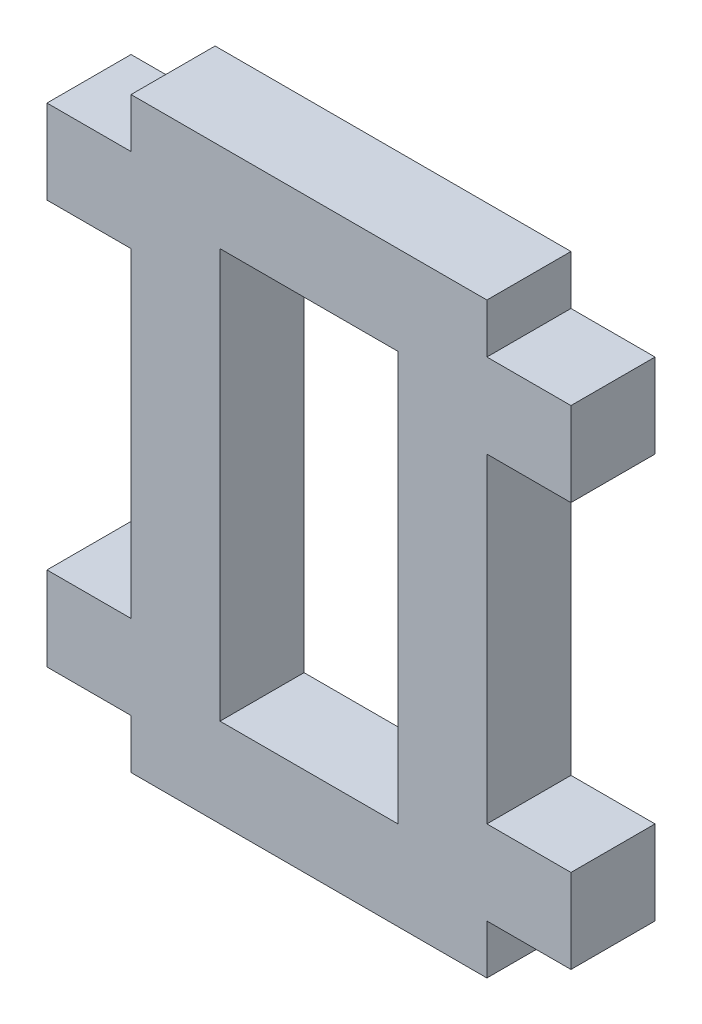
ISO-10303-21;
HEADER;
FILE_DESCRIPTION(('STEP AP214'),'2;1');
FILE_NAME('part.step','',(''),(''),'','','');
FILE_SCHEMA(('AUTOMOTIVE_DESIGN { 1 0 10303 214 1 1 1 1 }'));
ENDSEC;
DATA;
#1=APPLICATION_CONTEXT('core data for automotive mechanical design processes');
#2=APPLICATION_PROTOCOL_DEFINITION('international standard','automotive_design',2000,#1);
#3=PRODUCT_CONTEXT('',#1,'mechanical');
#4=PRODUCT('Part','Part','',(#3));
#5=PRODUCT_RELATED_PRODUCT_CATEGORY('part','',(#4));
#6=PRODUCT_DEFINITION_FORMATION('','',#4);
#7=PRODUCT_DEFINITION_CONTEXT('part definition',#1,'design');
#8=PRODUCT_DEFINITION('design','',#6,#7);
#9=PRODUCT_DEFINITION_SHAPE('','',#8);
#10=(LENGTH_UNIT() NAMED_UNIT(*) SI_UNIT(.MILLI.,.METRE.));
#11=(NAMED_UNIT(*) PLANE_ANGLE_UNIT() SI_UNIT($,.RADIAN.));
#12=(NAMED_UNIT(*) SI_UNIT($,.STERADIAN.) SOLID_ANGLE_UNIT());
#13=UNCERTAINTY_MEASURE_WITH_UNIT(LENGTH_MEASURE(1.E-05),#10,'distance_accuracy_value','');
#14=(GEOMETRIC_REPRESENTATION_CONTEXT(3) GLOBAL_UNCERTAINTY_ASSIGNED_CONTEXT((#13)) GLOBAL_UNIT_ASSIGNED_CONTEXT((#10,
#11,#12)) REPRESENTATION_CONTEXT('',''));
#15=CARTESIAN_POINT('',(0.,0.,0.));
#16=DIRECTION('',(0.,0.,1.));
#17=DIRECTION('',(1.,0.,0.));
#18=AXIS2_PLACEMENT_3D('',#15,#16,#17);
#19=CARTESIAN_POINT('',(-18.7,0.,6.));
#20=DIRECTION('',(1.,0.,0.));
#21=DIRECTION('',(0.,0.,-1.));
#22=AXIS2_PLACEMENT_3D('',#19,#20,#21);
#23=PLANE('',#22);
#24=DIRECTION('',(0.,-1.,0.));
#25=VECTOR('',#24,1.);
#26=CARTESIAN_POINT('',(-18.7,0.,0.));
#27=LINE('',#26,#25);
#28=CARTESIAN_POINT('',(-18.7,17.43,0.));
#29=VERTEX_POINT('',#28);
#30=CARTESIAN_POINT('',(-18.7,11.43,0.));
#31=VERTEX_POINT('',#30);
#32=EDGE_CURVE('E252',#29,#31,#27,.T.);
#33=ORIENTED_EDGE('',*,*,#32,.T.);
#34=DIRECTION('',(0.,0.,-1.));
#35=VECTOR('',#34,1.);
#36=CARTESIAN_POINT('',(-18.7,11.43,6.));
#37=LINE('',#36,#35);
#38=CARTESIAN_POINT('',(-18.7,11.43,6.));
#39=VERTEX_POINT('',#38);
#40=EDGE_CURVE('E11',#39,#31,#37,.T.);
#41=ORIENTED_EDGE('',*,*,#40,.F.);
#42=DIRECTION('',(0.,-1.,0.));
#43=VECTOR('',#42,1.);
#44=CARTESIAN_POINT('',(-18.7,0.,6.));
#45=LINE('',#44,#43);
#46=CARTESIAN_POINT('',(-18.7,17.43,6.));
#47=VERTEX_POINT('',#46);
#48=EDGE_CURVE('E258',#47,#39,#45,.T.);
#49=ORIENTED_EDGE('',*,*,#48,.F.);
#50=DIRECTION('',(0.,0.,-1.));
#51=VECTOR('',#50,1.);
#52=CARTESIAN_POINT('',(-18.7,17.43,6.));
#53=LINE('',#52,#51);
#54=EDGE_CURVE('E320',#47,#29,#53,.T.);
#55=ORIENTED_EDGE('',*,*,#54,.T.);
#56=EDGE_LOOP('',(#33,#41,#49,#55));
#57=FACE_BOUND('',#56,.T.);
#58=ADVANCED_FACE('F48',(#57),#23,.F.);
#59=CARTESIAN_POINT('',(0.,11.43,6.));
#60=DIRECTION('',(0.,1.,0.));
#61=DIRECTION('',(-1.,0.,0.));
#62=AXIS2_PLACEMENT_3D('',#59,#60,#61);
#63=PLANE('',#62);
#64=DIRECTION('',(1.,0.,0.));
#65=VECTOR('',#64,1.);
#66=CARTESIAN_POINT('',(0.,11.43,0.));
#67=LINE('',#66,#65);
#68=CARTESIAN_POINT('',(-12.7,11.43,0.));
#69=VERTEX_POINT('',#68);
#70=EDGE_CURVE('E324',#31,#69,#67,.T.);
#71=ORIENTED_EDGE('',*,*,#70,.T.);
#72=DIRECTION('',(0.,0.,-1.));
#73=VECTOR('',#72,1.);
#74=CARTESIAN_POINT('',(-12.7,11.43,6.));
#75=LINE('',#74,#73);
#76=CARTESIAN_POINT('',(-12.7,11.43,6.));
#77=VERTEX_POINT('',#76);
#78=EDGE_CURVE('E56',#77,#69,#75,.T.);
#79=ORIENTED_EDGE('',*,*,#78,.F.);
#80=DIRECTION('',(1.,0.,0.));
#81=VECTOR('',#80,1.);
#82=CARTESIAN_POINT('',(0.,11.43,6.));
#83=LINE('',#82,#81);
#84=EDGE_CURVE('E262',#39,#77,#83,.T.);
#85=ORIENTED_EDGE('',*,*,#84,.F.);
#86=ORIENTED_EDGE('',*,*,#40,.T.);
#87=EDGE_LOOP('',(#71,#79,#85,#86));
#88=FACE_BOUND('',#87,.T.);
#89=ADVANCED_FACE('F528',(#88),#63,.F.);
#90=CARTESIAN_POINT('',(-12.7,0.,6.));
#91=DIRECTION('',(1.,0.,0.));
#92=DIRECTION('',(0.,1.,0.));
#93=AXIS2_PLACEMENT_3D('',#90,#91,#92);
#94=PLANE('',#93);
#95=DIRECTION('',(0.,-1.,0.));
#96=VECTOR('',#95,1.);
#97=CARTESIAN_POINT('',(-12.7,0.,0.));
#98=LINE('',#97,#96);
#99=CARTESIAN_POINT('',(-12.7,-11.43,0.));
#100=VERTEX_POINT('',#99);
#101=EDGE_CURVE('E327',#69,#100,#98,.T.);
#102=ORIENTED_EDGE('',*,*,#101,.T.);
#103=DIRECTION('',(0.,0.,-1.));
#104=VECTOR('',#103,1.);
#105=CARTESIAN_POINT('',(-12.7,-11.43,6.));
#106=LINE('',#105,#104);
#107=CARTESIAN_POINT('',(-12.7,-11.43,6.));
#108=VERTEX_POINT('',#107);
#109=EDGE_CURVE('E437',#108,#100,#106,.T.);
#110=ORIENTED_EDGE('',*,*,#109,.F.);
#111=DIRECTION('',(0.,-1.,0.));
#112=VECTOR('',#111,1.);
#113=CARTESIAN_POINT('',(-12.7,0.,6.));
#114=LINE('',#113,#112);
#115=EDGE_CURVE('E266',#77,#108,#114,.T.);
#116=ORIENTED_EDGE('',*,*,#115,.F.);
#117=ORIENTED_EDGE('',*,*,#78,.T.);
#118=EDGE_LOOP('',(#102,#110,#116,#117));
#119=FACE_BOUND('',#118,.T.);
#120=ADVANCED_FACE('F445',(#119),#94,.F.);
#121=CARTESIAN_POINT('',(0.,-11.43,6.));
#122=DIRECTION('',(0.,1.,0.));
#123=DIRECTION('',(-1.,0.,0.));
#124=AXIS2_PLACEMENT_3D('',#121,#122,#123);
#125=PLANE('',#124);
#126=DIRECTION('',(1.,0.,0.));
#127=VECTOR('',#126,1.);
#128=CARTESIAN_POINT('',(0.,-11.43,0.));
#129=LINE('',#128,#127);
#130=CARTESIAN_POINT('',(-18.7,-11.43,0.));
#131=VERTEX_POINT('',#130);
#132=EDGE_CURVE('E331',#131,#100,#129,.T.);
#133=ORIENTED_EDGE('',*,*,#132,.F.);
#134=DIRECTION('',(0.,0.,-1.));
#135=VECTOR('',#134,1.);
#136=CARTESIAN_POINT('',(-18.7,-11.43,6.));
#137=LINE('',#136,#135);
#138=CARTESIAN_POINT('',(-18.7,-11.43,6.));
#139=VERTEX_POINT('',#138);
#140=EDGE_CURVE('E434',#139,#131,#137,.T.);
#141=ORIENTED_EDGE('',*,*,#140,.F.);
#142=DIRECTION('',(1.,0.,0.));
#143=VECTOR('',#142,1.);
#144=CARTESIAN_POINT('',(0.,-11.43,6.));
#145=LINE('',#144,#143);
#146=EDGE_CURVE('E269',#139,#108,#145,.T.);
#147=ORIENTED_EDGE('',*,*,#146,.T.);
#148=ORIENTED_EDGE('',*,*,#109,.T.);
#149=EDGE_LOOP('',(#133,#141,#147,#148));
#150=FACE_BOUND('',#149,.T.);
#151=ADVANCED_FACE('F453',(#150),#125,.T.);
#152=CARTESIAN_POINT('',(-18.7,0.,6.));
#153=DIRECTION('',(-1.,0.,0.));
#154=DIRECTION('',(0.,-1.,0.));
#155=AXIS2_PLACEMENT_3D('',#152,#153,#154);
#156=PLANE('',#155);
#157=DIRECTION('',(0.,1.,0.));
#158=VECTOR('',#157,1.);
#159=CARTESIAN_POINT('',(-18.7,0.,0.));
#160=LINE('',#159,#158);
#161=CARTESIAN_POINT('',(-18.7,-17.43,0.));
#162=VERTEX_POINT('',#161);
#163=EDGE_CURVE('E337',#162,#131,#160,.T.);
#164=ORIENTED_EDGE('',*,*,#163,.F.);
#165=DIRECTION('',(0.,0.,-1.));
#166=VECTOR('',#165,1.);
#167=CARTESIAN_POINT('',(-18.7,-17.43,6.));
#168=LINE('',#167,#166);
#169=CARTESIAN_POINT('',(-18.7,-17.43,6.));
#170=VERTEX_POINT('',#169);
#171=EDGE_CURVE('E431',#170,#162,#168,.T.);
#172=ORIENTED_EDGE('',*,*,#171,.F.);
#173=DIRECTION('',(0.,1.,0.));
#174=VECTOR('',#173,1.);
#175=CARTESIAN_POINT('',(-18.7,0.,6.));
#176=LINE('',#175,#174);
#177=EDGE_CURVE('E275',#170,#139,#176,.T.);
#178=ORIENTED_EDGE('',*,*,#177,.T.);
#179=ORIENTED_EDGE('',*,*,#140,.T.);
#180=EDGE_LOOP('',(#164,#172,#178,#179));
#181=FACE_BOUND('',#180,.T.);
#182=ADVANCED_FACE('F459',(#181),#156,.T.);
#183=CARTESIAN_POINT('',(0.,-17.43,6.));
#184=DIRECTION('',(0.,1.,0.));
#185=DIRECTION('',(-1.,0.,0.));
#186=AXIS2_PLACEMENT_3D('',#183,#184,#185);
#187=PLANE('',#186);
#188=DIRECTION('',(1.,0.,0.));
#189=VECTOR('',#188,1.);
#190=CARTESIAN_POINT('',(0.,-17.43,0.));
#191=LINE('',#190,#189);
#192=CARTESIAN_POINT('',(-12.7,-17.43,0.));
#193=VERTEX_POINT('',#192);
#194=EDGE_CURVE('E341',#162,#193,#191,.T.);
#195=ORIENTED_EDGE('',*,*,#194,.T.);
#196=DIRECTION('',(0.,0.,-1.));
#197=VECTOR('',#196,1.);
#198=CARTESIAN_POINT('',(-12.7,-17.43,6.));
#199=LINE('',#198,#197);
#200=CARTESIAN_POINT('',(-12.7,-17.43,6.));
#201=VERTEX_POINT('',#200);
#202=EDGE_CURVE('E427',#201,#193,#199,.T.);
#203=ORIENTED_EDGE('',*,*,#202,.F.);
#204=DIRECTION('',(1.,0.,0.));
#205=VECTOR('',#204,1.);
#206=CARTESIAN_POINT('',(0.,-17.43,6.));
#207=LINE('',#206,#205);
#208=EDGE_CURVE('E279',#170,#201,#207,.T.);
#209=ORIENTED_EDGE('',*,*,#208,.F.);
#210=ORIENTED_EDGE('',*,*,#171,.T.);
#211=EDGE_LOOP('',(#195,#203,#209,#210));
#212=FACE_BOUND('',#211,.T.);
#213=ADVANCED_FACE('F463',(#212),#187,.F.);
#214=CARTESIAN_POINT('',(-12.7,-20.955,0.));
#215=VERTEX_POINT('',#214);
#216=EDGE_CURVE('E333',#193,#215,#98,.T.);
#217=ORIENTED_EDGE('',*,*,#216,.T.);
#218=DIRECTION('',(0.,0.,-1.));
#219=VECTOR('',#218,1.);
#220=CARTESIAN_POINT('',(-12.7,-20.955,6.));
#221=LINE('',#220,#219);
#222=CARTESIAN_POINT('',(-12.7,-20.955,6.));
#223=VERTEX_POINT('',#222);
#224=EDGE_CURVE('E423',#223,#215,#221,.T.);
#225=ORIENTED_EDGE('',*,*,#224,.F.);
#226=EDGE_CURVE('E271',#201,#223,#114,.T.);
#227=ORIENTED_EDGE('',*,*,#226,.F.);
#228=ORIENTED_EDGE('',*,*,#202,.T.);
#229=EDGE_LOOP('',(#217,#225,#227,#228));
#230=FACE_BOUND('',#229,.T.);
#231=ADVANCED_FACE('F471',(#230),#94,.F.);
#232=CARTESIAN_POINT('',(0.,-20.955,6.));
#233=DIRECTION('',(0.,1.,0.));
#234=DIRECTION('',(0.,0.,1.));
#235=AXIS2_PLACEMENT_3D('',#232,#233,#234);
#236=PLANE('',#235);
#237=DIRECTION('',(1.,0.,0.));
#238=VECTOR('',#237,1.);
#239=CARTESIAN_POINT('',(0.,-20.955,0.));
#240=LINE('',#239,#238);
#241=CARTESIAN_POINT('',(12.7,-20.955,0.));
#242=VERTEX_POINT('',#241);
#243=EDGE_CURVE('E344',#215,#242,#240,.T.);
#244=ORIENTED_EDGE('',*,*,#243,.T.);
#245=DIRECTION('',(0.,0.,-1.));
#246=VECTOR('',#245,1.);
#247=CARTESIAN_POINT('',(12.7,-20.955,6.));
#248=LINE('',#247,#246);
#249=CARTESIAN_POINT('',(12.7,-20.955,6.));
#250=VERTEX_POINT('',#249);
#251=EDGE_CURVE('E420',#250,#242,#248,.T.);
#252=ORIENTED_EDGE('',*,*,#251,.F.);
#253=DIRECTION('',(1.,0.,0.));
#254=VECTOR('',#253,1.);
#255=CARTESIAN_POINT('',(0.,-20.955,6.));
#256=LINE('',#255,#254);
#257=EDGE_CURVE('E282',#223,#250,#256,.T.);
#258=ORIENTED_EDGE('',*,*,#257,.F.);
#259=ORIENTED_EDGE('',*,*,#224,.T.);
#260=EDGE_LOOP('',(#244,#252,#258,#259));
#261=FACE_BOUND('',#260,.T.);
#262=ADVANCED_FACE('F475',(#261),#236,.F.);
#263=CARTESIAN_POINT('',(12.7,0.,6.));
#264=DIRECTION('',(1.,0.,0.));
#265=DIRECTION('',(0.,0.,-1.));
#266=AXIS2_PLACEMENT_3D('',#263,#264,#265);
#267=PLANE('',#266);
#268=DIRECTION('',(0.,-1.,0.));
#269=VECTOR('',#268,1.);
#270=CARTESIAN_POINT('',(12.7,0.,0.));
#271=LINE('',#270,#269);
#272=CARTESIAN_POINT('',(12.7,-17.43,0.));
#273=VERTEX_POINT('',#272);
#274=EDGE_CURVE('E348',#273,#242,#271,.T.);
#275=ORIENTED_EDGE('',*,*,#274,.F.);
#276=DIRECTION('',(0.,0.,-1.));
#277=VECTOR('',#276,1.);
#278=CARTESIAN_POINT('',(12.7,-17.43,6.));
#279=LINE('',#278,#277);
#280=CARTESIAN_POINT('',(12.7,-17.43,6.));
#281=VERTEX_POINT('',#280);
#282=EDGE_CURVE('E417',#281,#273,#279,.T.);
#283=ORIENTED_EDGE('',*,*,#282,.F.);
#284=DIRECTION('',(0.,-1.,0.));
#285=VECTOR('',#284,1.);
#286=CARTESIAN_POINT('',(12.7,0.,6.));
#287=LINE('',#286,#285);
#288=EDGE_CURVE('E285',#281,#250,#287,.T.);
#289=ORIENTED_EDGE('',*,*,#288,.T.);
#290=ORIENTED_EDGE('',*,*,#251,.T.);
#291=EDGE_LOOP('',(#275,#283,#289,#290));
#292=FACE_BOUND('',#291,.T.);
#293=ADVANCED_FACE('F478',(#292),#267,.T.);
#294=CARTESIAN_POINT('',(0.,-17.43,6.));
#295=DIRECTION('',(0.,-1.,0.));
#296=DIRECTION('',(1.,0.,0.));
#297=AXIS2_PLACEMENT_3D('',#294,#295,#296);
#298=PLANE('',#297);
#299=DIRECTION('',(-1.,0.,0.));
#300=VECTOR('',#299,1.);
#301=CARTESIAN_POINT('',(0.,-17.43,0.));
#302=LINE('',#301,#300);
#303=CARTESIAN_POINT('',(18.7,-17.43,0.));
#304=VERTEX_POINT('',#303);
#305=EDGE_CURVE('E352',#304,#273,#302,.T.);
#306=ORIENTED_EDGE('',*,*,#305,.F.);
#307=DIRECTION('',(0.,0.,-1.));
#308=VECTOR('',#307,1.);
#309=CARTESIAN_POINT('',(18.7,-17.43,6.));
#310=LINE('',#309,#308);
#311=CARTESIAN_POINT('',(18.7,-17.43,6.));
#312=VERTEX_POINT('',#311);
#313=EDGE_CURVE('E414',#312,#304,#310,.T.);
#314=ORIENTED_EDGE('',*,*,#313,.F.);
#315=DIRECTION('',(-1.,0.,0.));
#316=VECTOR('',#315,1.);
#317=CARTESIAN_POINT('',(0.,-17.43,6.));
#318=LINE('',#317,#316);
#319=EDGE_CURVE('E289',#312,#281,#318,.T.);
#320=ORIENTED_EDGE('',*,*,#319,.T.);
#321=ORIENTED_EDGE('',*,*,#282,.T.);
#322=EDGE_LOOP('',(#306,#314,#320,#321));
#323=FACE_BOUND('',#322,.T.);
#324=ADVANCED_FACE('F482',(#323),#298,.T.);
#325=CARTESIAN_POINT('',(18.7,0.,6.));
#326=DIRECTION('',(-1.,0.,0.));
#327=DIRECTION('',(0.,-1.,0.));
#328=AXIS2_PLACEMENT_3D('',#325,#326,#327);
#329=PLANE('',#328);
#330=DIRECTION('',(0.,1.,0.));
#331=VECTOR('',#330,1.);
#332=CARTESIAN_POINT('',(18.7,0.,0.));
#333=LINE('',#332,#331);
#334=CARTESIAN_POINT('',(18.7,-11.43,0.));
#335=VERTEX_POINT('',#334);
#336=EDGE_CURVE('E358',#304,#335,#333,.T.);
#337=ORIENTED_EDGE('',*,*,#336,.T.);
#338=DIRECTION('',(0.,0.,-1.));
#339=VECTOR('',#338,1.);
#340=CARTESIAN_POINT('',(18.7,-11.43,6.));
#341=LINE('',#340,#339);
#342=CARTESIAN_POINT('',(18.7,-11.43,6.));
#343=VERTEX_POINT('',#342);
#344=EDGE_CURVE('E410',#343,#335,#341,.T.);
#345=ORIENTED_EDGE('',*,*,#344,.F.);
#346=DIRECTION('',(0.,1.,0.));
#347=VECTOR('',#346,1.);
#348=CARTESIAN_POINT('',(18.7,0.,6.));
#349=LINE('',#348,#347);
#350=EDGE_CURVE('E295',#312,#343,#349,.T.);
#351=ORIENTED_EDGE('',*,*,#350,.F.);
#352=ORIENTED_EDGE('',*,*,#313,.T.);
#353=EDGE_LOOP('',(#337,#345,#351,#352));
#354=FACE_BOUND('',#353,.T.);
#355=ADVANCED_FACE('F487',(#354),#329,.F.);
#356=CARTESIAN_POINT('',(0.,-11.43,6.));
#357=DIRECTION('',(0.,-1.,0.));
#358=DIRECTION('',(1.,0.,0.));
#359=AXIS2_PLACEMENT_3D('',#356,#357,#358);
#360=PLANE('',#359);
#361=DIRECTION('',(-1.,0.,0.));
#362=VECTOR('',#361,1.);
#363=CARTESIAN_POINT('',(0.,-11.43,0.));
#364=LINE('',#363,#362);
#365=CARTESIAN_POINT('',(12.7,-11.43,0.));
#366=VERTEX_POINT('',#365);
#367=EDGE_CURVE('E361',#335,#366,#364,.T.);
#368=ORIENTED_EDGE('',*,*,#367,.T.);
#369=DIRECTION('',(0.,0.,-1.));
#370=VECTOR('',#369,1.);
#371=CARTESIAN_POINT('',(12.7,-11.43,6.));
#372=LINE('',#371,#370);
#373=CARTESIAN_POINT('',(12.7,-11.43,6.));
#374=VERTEX_POINT('',#373);
#375=EDGE_CURVE('E407',#374,#366,#372,.T.);
#376=ORIENTED_EDGE('',*,*,#375,.F.);
#377=DIRECTION('',(-1.,0.,0.));
#378=VECTOR('',#377,1.);
#379=CARTESIAN_POINT('',(0.,-11.43,6.));
#380=LINE('',#379,#378);
#381=EDGE_CURVE('E298',#343,#374,#380,.T.);
#382=ORIENTED_EDGE('',*,*,#381,.F.);
#383=ORIENTED_EDGE('',*,*,#344,.T.);
#384=EDGE_LOOP('',(#368,#376,#382,#383));
#385=FACE_BOUND('',#384,.T.);
#386=ADVANCED_FACE('F494',(#385),#360,.F.);
#387=CARTESIAN_POINT('',(12.7,11.43,0.));
#388=VERTEX_POINT('',#387);
#389=EDGE_CURVE('E354',#388,#366,#271,.T.);
#390=ORIENTED_EDGE('',*,*,#389,.F.);
#391=DIRECTION('',(0.,0.,-1.));
#392=VECTOR('',#391,1.);
#393=CARTESIAN_POINT('',(12.7,11.43,6.));
#394=LINE('',#393,#392);
#395=CARTESIAN_POINT('',(12.7,11.43,6.));
#396=VERTEX_POINT('',#395);
#397=EDGE_CURVE('E404',#396,#388,#394,.T.);
#398=ORIENTED_EDGE('',*,*,#397,.F.);
#399=EDGE_CURVE('E291',#396,#374,#287,.T.);
#400=ORIENTED_EDGE('',*,*,#399,.T.);
#401=ORIENTED_EDGE('',*,*,#375,.T.);
#402=EDGE_LOOP('',(#390,#398,#400,#401));
#403=FACE_BOUND('',#402,.T.);
#404=ADVANCED_FACE('F499',(#403),#267,.T.);
#405=CARTESIAN_POINT('',(0.,11.43,6.));
#406=DIRECTION('',(0.,-1.,0.));
#407=DIRECTION('',(1.,0.,0.));
#408=AXIS2_PLACEMENT_3D('',#405,#406,#407);
#409=PLANE('',#408);
#410=DIRECTION('',(-1.,0.,0.));
#411=VECTOR('',#410,1.);
#412=CARTESIAN_POINT('',(0.,11.43,0.));
#413=LINE('',#412,#411);
#414=CARTESIAN_POINT('',(18.7,11.43,0.));
#415=VERTEX_POINT('',#414);
#416=EDGE_CURVE('E365',#415,#388,#413,.T.);
#417=ORIENTED_EDGE('',*,*,#416,.F.);
#418=DIRECTION('',(0.,0.,-1.));
#419=VECTOR('',#418,1.);
#420=CARTESIAN_POINT('',(18.7,11.43,6.));
#421=LINE('',#420,#419);
#422=CARTESIAN_POINT('',(18.7,11.43,6.));
#423=VERTEX_POINT('',#422);
#424=EDGE_CURVE('E401',#423,#415,#421,.T.);
#425=ORIENTED_EDGE('',*,*,#424,.F.);
#426=DIRECTION('',(-1.,0.,0.));
#427=VECTOR('',#426,1.);
#428=CARTESIAN_POINT('',(0.,11.43,6.));
#429=LINE('',#428,#427);
#430=EDGE_CURVE('E301',#423,#396,#429,.T.);
#431=ORIENTED_EDGE('',*,*,#430,.T.);
#432=ORIENTED_EDGE('',*,*,#397,.T.);
#433=EDGE_LOOP('',(#417,#425,#431,#432));
#434=FACE_BOUND('',#433,.T.);
#435=ADVANCED_FACE('F550',(#434),#409,.T.);
#436=CARTESIAN_POINT('',(18.7,0.,6.));
#437=DIRECTION('',(1.,0.,0.));
#438=DIRECTION('',(0.,0.,-1.));
#439=AXIS2_PLACEMENT_3D('',#436,#437,#438);
#440=PLANE('',#439);
#441=DIRECTION('',(0.,-1.,0.));
#442=VECTOR('',#441,1.);
#443=CARTESIAN_POINT('',(18.7,0.,0.));
#444=LINE('',#443,#442);
#445=CARTESIAN_POINT('',(18.7,17.43,0.));
#446=VERTEX_POINT('',#445);
#447=EDGE_CURVE('E369',#446,#415,#444,.T.);
#448=ORIENTED_EDGE('',*,*,#447,.F.);
#449=DIRECTION('',(0.,0.,-1.));
#450=VECTOR('',#449,1.);
#451=CARTESIAN_POINT('',(18.7,17.43,6.));
#452=LINE('',#451,#450);
#453=CARTESIAN_POINT('',(18.7,17.43,6.));
#454=VERTEX_POINT('',#453);
#455=EDGE_CURVE('E398',#454,#446,#452,.T.);
#456=ORIENTED_EDGE('',*,*,#455,.F.);
#457=DIRECTION('',(0.,-1.,0.));
#458=VECTOR('',#457,1.);
#459=CARTESIAN_POINT('',(18.7,0.,6.));
#460=LINE('',#459,#458);
#461=EDGE_CURVE('E305',#454,#423,#460,.T.);
#462=ORIENTED_EDGE('',*,*,#461,.T.);
#463=ORIENTED_EDGE('',*,*,#424,.T.);
#464=EDGE_LOOP('',(#448,#456,#462,#463));
#465=FACE_BOUND('',#464,.T.);
#466=ADVANCED_FACE('F553',(#465),#440,.T.);
#467=CARTESIAN_POINT('',(0.,17.43,6.));
#468=DIRECTION('',(0.,-1.,0.));
#469=DIRECTION('',(0.,0.,-1.));
#470=AXIS2_PLACEMENT_3D('',#467,#468,#469);
#471=PLANE('',#470);
#472=DIRECTION('',(-1.,0.,0.));
#473=VECTOR('',#472,1.);
#474=CARTESIAN_POINT('',(0.,17.43,0.));
#475=LINE('',#474,#473);
#476=CARTESIAN_POINT('',(12.7,17.43,0.));
#477=VERTEX_POINT('',#476);
#478=EDGE_CURVE('E373',#446,#477,#475,.T.);
#479=ORIENTED_EDGE('',*,*,#478,.T.);
#480=DIRECTION('',(0.,0.,-1.));
#481=VECTOR('',#480,1.);
#482=CARTESIAN_POINT('',(12.7,17.43,6.));
#483=LINE('',#482,#481);
#484=CARTESIAN_POINT('',(12.7,17.43,6.));
#485=VERTEX_POINT('',#484);
#486=EDGE_CURVE('E395',#485,#477,#483,.T.);
#487=ORIENTED_EDGE('',*,*,#486,.F.);
#488=DIRECTION('',(-1.,0.,0.));
#489=VECTOR('',#488,1.);
#490=CARTESIAN_POINT('',(0.,17.43,6.));
#491=LINE('',#490,#489);
#492=EDGE_CURVE('E309',#454,#485,#491,.T.);
#493=ORIENTED_EDGE('',*,*,#492,.F.);
#494=ORIENTED_EDGE('',*,*,#455,.T.);
#495=EDGE_LOOP('',(#479,#487,#493,#494));
#496=FACE_BOUND('',#495,.T.);
#497=ADVANCED_FACE('F557',(#496),#471,.F.);
#498=CARTESIAN_POINT('',(12.7,20.955,0.));
#499=VERTEX_POINT('',#498);
#500=EDGE_CURVE('E353',#499,#477,#271,.T.);
#501=ORIENTED_EDGE('',*,*,#500,.F.);
#502=DIRECTION('',(0.,0.,-1.));
#503=VECTOR('',#502,1.);
#504=CARTESIAN_POINT('',(12.7,20.955,6.));
#505=LINE('',#504,#503);
#506=CARTESIAN_POINT('',(12.7,20.955,6.));
#507=VERTEX_POINT('',#506);
#508=EDGE_CURVE('E392',#507,#499,#505,.T.);
#509=ORIENTED_EDGE('',*,*,#508,.F.);
#510=EDGE_CURVE('E290',#507,#485,#287,.T.);
#511=ORIENTED_EDGE('',*,*,#510,.T.);
#512=ORIENTED_EDGE('',*,*,#486,.T.);
#513=EDGE_LOOP('',(#501,#509,#511,#512));
#514=FACE_BOUND('',#513,.T.);
#515=ADVANCED_FACE('F506',(#514),#267,.T.);
#516=CARTESIAN_POINT('',(0.,20.955,6.));
#517=DIRECTION('',(0.,1.,0.));
#518=DIRECTION('',(0.,0.,1.));
#519=AXIS2_PLACEMENT_3D('',#516,#517,#518);
#520=PLANE('',#519);
#521=DIRECTION('',(1.,0.,0.));
#522=VECTOR('',#521,1.);
#523=CARTESIAN_POINT('',(0.,20.955,0.));
#524=LINE('',#523,#522);
#525=CARTESIAN_POINT('',(-12.7,20.955,0.));
#526=VERTEX_POINT('',#525);
#527=EDGE_CURVE('E377',#526,#499,#524,.T.);
#528=ORIENTED_EDGE('',*,*,#527,.F.);
#529=DIRECTION('',(0.,0.,-1.));
#530=VECTOR('',#529,1.);
#531=CARTESIAN_POINT('',(-12.7,20.955,6.));
#532=LINE('',#531,#530);
#533=CARTESIAN_POINT('',(-12.7,20.955,6.));
#534=VERTEX_POINT('',#533);
#535=EDGE_CURVE('E389',#534,#526,#532,.T.);
#536=ORIENTED_EDGE('',*,*,#535,.F.);
#537=DIRECTION('',(1.,0.,0.));
#538=VECTOR('',#537,1.);
#539=CARTESIAN_POINT('',(0.,20.955,6.));
#540=LINE('',#539,#538);
#541=EDGE_CURVE('E312',#534,#507,#540,.T.);
#542=ORIENTED_EDGE('',*,*,#541,.T.);
#543=ORIENTED_EDGE('',*,*,#508,.T.);
#544=EDGE_LOOP('',(#528,#536,#542,#543));
#545=FACE_BOUND('',#544,.T.);
#546=ADVANCED_FACE('F513',(#545),#520,.T.);
#547=CARTESIAN_POINT('',(-12.7,17.43,0.));
#548=VERTEX_POINT('',#547);
#549=EDGE_CURVE('E332',#526,#548,#98,.T.);
#550=ORIENTED_EDGE('',*,*,#549,.T.);
#551=DIRECTION('',(0.,0.,-1.));
#552=VECTOR('',#551,1.);
#553=CARTESIAN_POINT('',(-12.7,17.43,6.));
#554=LINE('',#553,#552);
#555=CARTESIAN_POINT('',(-12.7,17.43,6.));
#556=VERTEX_POINT('',#555);
#557=EDGE_CURVE('E386',#556,#548,#554,.T.);
#558=ORIENTED_EDGE('',*,*,#557,.F.);
#559=EDGE_CURVE('E270',#534,#556,#114,.T.);
#560=ORIENTED_EDGE('',*,*,#559,.F.);
#561=ORIENTED_EDGE('',*,*,#535,.T.);
#562=EDGE_LOOP('',(#550,#558,#560,#561));
#563=FACE_BOUND('',#562,.T.);
#564=ADVANCED_FACE('F519',(#563),#94,.F.);
#565=CARTESIAN_POINT('',(0.,17.43,6.));
#566=DIRECTION('',(0.,1.,0.));
#567=DIRECTION('',(0.,0.,1.));
#568=AXIS2_PLACEMENT_3D('',#565,#566,#567);
#569=PLANE('',#568);
#570=DIRECTION('',(1.,0.,0.));
#571=VECTOR('',#570,1.);
#572=CARTESIAN_POINT('',(0.,17.43,0.));
#573=LINE('',#572,#571);
#574=EDGE_CURVE('E263',#29,#548,#573,.T.);
#575=ORIENTED_EDGE('',*,*,#574,.F.);
#576=ORIENTED_EDGE('',*,*,#54,.F.);
#577=DIRECTION('',(1.,0.,0.));
#578=VECTOR('',#577,1.);
#579=CARTESIAN_POINT('',(0.,17.43,6.));
#580=LINE('',#579,#578);
#581=EDGE_CURVE('E316',#47,#556,#580,.T.);
#582=ORIENTED_EDGE('',*,*,#581,.T.);
#583=ORIENTED_EDGE('',*,*,#557,.T.);
#584=EDGE_LOOP('',(#575,#576,#582,#583));
#585=FACE_BOUND('',#584,.T.);
#586=ADVANCED_FACE('F526',(#585),#569,.T.);
#587=CARTESIAN_POINT('',(0.,0.,6.));
#588=DIRECTION('',(0.,0.,1.));
#589=DIRECTION('',(1.,0.,0.));
#590=AXIS2_PLACEMENT_3D('',#587,#588,#589);
#591=PLANE('',#590);
#592=DIRECTION('',(0.,-1.,0.));
#593=VECTOR('',#592,1.);
#594=CARTESIAN_POINT('',(-6.35,14.605,6.));
#595=LINE('',#594,#593);
#596=CARTESIAN_POINT('',(-6.35,14.605,6.));
#597=VERTEX_POINT('',#596);
#598=CARTESIAN_POINT('',(-6.35,-14.605,6.));
#599=VERTEX_POINT('',#598);
#600=EDGE_CURVE('E63',#597,#599,#595,.T.);
#601=ORIENTED_EDGE('',*,*,#600,.F.);
#602=DIRECTION('',(-1.,0.,0.));
#603=VECTOR('',#602,1.);
#604=CARTESIAN_POINT('',(-6.35,14.605,6.));
#605=LINE('',#604,#603);
#606=CARTESIAN_POINT('',(6.35,14.605,6.));
#607=VERTEX_POINT('',#606);
#608=EDGE_CURVE('E230',#607,#597,#605,.T.);
#609=ORIENTED_EDGE('',*,*,#608,.F.);
#610=DIRECTION('',(0.,1.,0.));
#611=VECTOR('',#610,1.);
#612=CARTESIAN_POINT('',(6.35,14.605,6.));
#613=LINE('',#612,#611);
#614=CARTESIAN_POINT('',(6.35,-14.605,6.));
#615=VERTEX_POINT('',#614);
#616=EDGE_CURVE('E234',#615,#607,#613,.T.);
#617=ORIENTED_EDGE('',*,*,#616,.F.);
#618=DIRECTION('',(1.,0.,0.));
#619=VECTOR('',#618,1.);
#620=CARTESIAN_POINT('',(-6.35,-14.605,6.));
#621=LINE('',#620,#619);
#622=EDGE_CURVE('E243',#599,#615,#621,.T.);
#623=ORIENTED_EDGE('',*,*,#622,.F.);
#624=EDGE_LOOP('',(#601,#609,#617,#623));
#625=FACE_BOUND('',#624,.T.);
#626=ORIENTED_EDGE('',*,*,#48,.T.);
#627=ORIENTED_EDGE('',*,*,#84,.T.);
#628=ORIENTED_EDGE('',*,*,#115,.T.);
#629=ORIENTED_EDGE('',*,*,#146,.F.);
#630=ORIENTED_EDGE('',*,*,#177,.F.);
#631=ORIENTED_EDGE('',*,*,#208,.T.);
#632=ORIENTED_EDGE('',*,*,#226,.T.);
#633=ORIENTED_EDGE('',*,*,#257,.T.);
#634=ORIENTED_EDGE('',*,*,#288,.F.);
#635=ORIENTED_EDGE('',*,*,#319,.F.);
#636=ORIENTED_EDGE('',*,*,#350,.T.);
#637=ORIENTED_EDGE('',*,*,#381,.T.);
#638=ORIENTED_EDGE('',*,*,#399,.F.);
#639=ORIENTED_EDGE('',*,*,#430,.F.);
#640=ORIENTED_EDGE('',*,*,#461,.F.);
#641=ORIENTED_EDGE('',*,*,#492,.T.);
#642=ORIENTED_EDGE('',*,*,#510,.F.);
#643=ORIENTED_EDGE('',*,*,#541,.F.);
#644=ORIENTED_EDGE('',*,*,#559,.T.);
#645=ORIENTED_EDGE('',*,*,#581,.F.);
#646=EDGE_LOOP('',(#626,#627,#628,#629,#630,#631,#632,#633,#634,#635,#636,#637,#638,#639,#640,
#641,#642,#643,#644,#645));
#647=FACE_BOUND('',#646,.T.);
#648=ADVANCED_FACE('F457',(#625,#647),#591,.T.);
#649=CARTESIAN_POINT('',(0.,0.,0.));
#650=DIRECTION('',(0.,0.,1.));
#651=DIRECTION('',(1.,0.,0.));
#652=AXIS2_PLACEMENT_3D('',#649,#650,#651);
#653=PLANE('',#652);
#654=DIRECTION('',(-1.,0.,0.));
#655=VECTOR('',#654,1.);
#656=CARTESIAN_POINT('',(-6.35,14.605,0.));
#657=LINE('',#656,#655);
#658=CARTESIAN_POINT('',(6.35,14.605,0.));
#659=VERTEX_POINT('',#658);
#660=CARTESIAN_POINT('',(-6.35,14.605,0.));
#661=VERTEX_POINT('',#660);
#662=EDGE_CURVE('E218',#659,#661,#657,.T.);
#663=ORIENTED_EDGE('',*,*,#662,.T.);
#664=DIRECTION('',(0.,-1.,0.));
#665=VECTOR('',#664,1.);
#666=CARTESIAN_POINT('',(-6.35,14.605,0.));
#667=LINE('',#666,#665);
#668=CARTESIAN_POINT('',(-6.35,-14.605,0.));
#669=VERTEX_POINT('',#668);
#670=EDGE_CURVE('E211',#661,#669,#667,.T.);
#671=ORIENTED_EDGE('',*,*,#670,.T.);
#672=DIRECTION('',(1.,0.,0.));
#673=VECTOR('',#672,1.);
#674=CARTESIAN_POINT('',(-6.35,-14.605,0.));
#675=LINE('',#674,#673);
#676=CARTESIAN_POINT('',(6.35,-14.605,0.));
#677=VERTEX_POINT('',#676);
#678=EDGE_CURVE('E221',#669,#677,#675,.T.);
#679=ORIENTED_EDGE('',*,*,#678,.T.);
#680=DIRECTION('',(0.,1.,0.));
#681=VECTOR('',#680,1.);
#682=CARTESIAN_POINT('',(6.35,14.605,0.));
#683=LINE('',#682,#681);
#684=EDGE_CURVE('E71',#677,#659,#683,.T.);
#685=ORIENTED_EDGE('',*,*,#684,.T.);
#686=EDGE_LOOP('',(#663,#671,#679,#685));
#687=FACE_BOUND('',#686,.T.);
#688=ORIENTED_EDGE('',*,*,#32,.F.);
#689=ORIENTED_EDGE('',*,*,#574,.T.);
#690=ORIENTED_EDGE('',*,*,#549,.F.);
#691=ORIENTED_EDGE('',*,*,#527,.T.);
#692=ORIENTED_EDGE('',*,*,#500,.T.);
#693=ORIENTED_EDGE('',*,*,#478,.F.);
#694=ORIENTED_EDGE('',*,*,#447,.T.);
#695=ORIENTED_EDGE('',*,*,#416,.T.);
#696=ORIENTED_EDGE('',*,*,#389,.T.);
#697=ORIENTED_EDGE('',*,*,#367,.F.);
#698=ORIENTED_EDGE('',*,*,#336,.F.);
#699=ORIENTED_EDGE('',*,*,#305,.T.);
#700=ORIENTED_EDGE('',*,*,#274,.T.);
#701=ORIENTED_EDGE('',*,*,#243,.F.);
#702=ORIENTED_EDGE('',*,*,#216,.F.);
#703=ORIENTED_EDGE('',*,*,#194,.F.);
#704=ORIENTED_EDGE('',*,*,#163,.T.);
#705=ORIENTED_EDGE('',*,*,#132,.T.);
#706=ORIENTED_EDGE('',*,*,#101,.F.);
#707=ORIENTED_EDGE('',*,*,#70,.F.);
#708=EDGE_LOOP('',(#688,#689,#690,#691,#692,#693,#694,#695,#696,#697,#698,#699,#700,#701,#702,
#703,#704,#705,#706,#707));
#709=FACE_BOUND('',#708,.T.);
#710=ADVANCED_FACE('F226',(#687,#709),#653,.F.);
#711=CARTESIAN_POINT('',(-6.35,14.605,0.));
#712=DIRECTION('',(-1.,0.,0.));
#713=DIRECTION('',(0.,0.,1.));
#714=AXIS2_PLACEMENT_3D('',#711,#712,#713);
#715=PLANE('',#714);
#716=ORIENTED_EDGE('',*,*,#600,.T.);
#717=DIRECTION('',(0.,0.,1.));
#718=VECTOR('',#717,1.);
#719=CARTESIAN_POINT('',(-6.35,-14.605,0.));
#720=LINE('',#719,#718);
#721=EDGE_CURVE('E207',#669,#599,#720,.T.);
#722=ORIENTED_EDGE('',*,*,#721,.F.);
#723=ORIENTED_EDGE('',*,*,#670,.F.);
#724=DIRECTION('',(0.,0.,1.));
#725=VECTOR('',#724,1.);
#726=CARTESIAN_POINT('',(-6.35,14.605,0.));
#727=LINE('',#726,#725);
#728=EDGE_CURVE('E249',#661,#597,#727,.T.);
#729=ORIENTED_EDGE('',*,*,#728,.T.);
#730=EDGE_LOOP('',(#716,#722,#723,#729));
#731=FACE_BOUND('',#730,.T.);
#732=ADVANCED_FACE('F209',(#731),#715,.F.);
#733=CARTESIAN_POINT('',(-6.35,14.605,0.));
#734=DIRECTION('',(0.,1.,0.));
#735=DIRECTION('',(0.,0.,1.));
#736=AXIS2_PLACEMENT_3D('',#733,#734,#735);
#737=PLANE('',#736);
#738=ORIENTED_EDGE('',*,*,#608,.T.);
#739=ORIENTED_EDGE('',*,*,#728,.F.);
#740=ORIENTED_EDGE('',*,*,#662,.F.);
#741=DIRECTION('',(0.,0.,1.));
#742=VECTOR('',#741,1.);
#743=CARTESIAN_POINT('',(6.35,14.605,0.));
#744=LINE('',#743,#742);
#745=EDGE_CURVE('E253',#659,#607,#744,.T.);
#746=ORIENTED_EDGE('',*,*,#745,.T.);
#747=EDGE_LOOP('',(#738,#739,#740,#746));
#748=FACE_BOUND('',#747,.T.);
#749=ADVANCED_FACE('F576',(#748),#737,.F.);
#750=CARTESIAN_POINT('',(6.35,14.605,0.));
#751=DIRECTION('',(1.,0.,0.));
#752=DIRECTION('',(0.,1.,0.));
#753=AXIS2_PLACEMENT_3D('',#750,#751,#752);
#754=PLANE('',#753);
#755=ORIENTED_EDGE('',*,*,#616,.T.);
#756=ORIENTED_EDGE('',*,*,#745,.F.);
#757=ORIENTED_EDGE('',*,*,#684,.F.);
#758=DIRECTION('',(0.,0.,1.));
#759=VECTOR('',#758,1.);
#760=CARTESIAN_POINT('',(6.35,-14.605,0.));
#761=LINE('',#760,#759);
#762=EDGE_CURVE('E217',#677,#615,#761,.T.);
#763=ORIENTED_EDGE('',*,*,#762,.T.);
#764=EDGE_LOOP('',(#755,#756,#757,#763));
#765=FACE_BOUND('',#764,.T.);
#766=ADVANCED_FACE('F579',(#765),#754,.F.);
#767=CARTESIAN_POINT('',(-6.35,-14.605,0.));
#768=DIRECTION('',(0.,-1.,0.));
#769=DIRECTION('',(1.,0.,0.));
#770=AXIS2_PLACEMENT_3D('',#767,#768,#769);
#771=PLANE('',#770);
#772=ORIENTED_EDGE('',*,*,#622,.T.);
#773=ORIENTED_EDGE('',*,*,#762,.F.);
#774=ORIENTED_EDGE('',*,*,#678,.F.);
#775=ORIENTED_EDGE('',*,*,#721,.T.);
#776=EDGE_LOOP('',(#772,#773,#774,#775));
#777=FACE_BOUND('',#776,.T.);
#778=ADVANCED_FACE('F222',(#777),#771,.F.);
#779=CLOSED_SHELL('',(#58,#89,#120,#151,#182,#213,#231,#262,#293,#324,#355,#386,#404,#435,#466,
#497,#515,#546,#564,#586,#648,#710,#732,#749,#766,#778));
#780=MANIFOLD_SOLID_BREP('B2',#779);
#781=ADVANCED_BREP_SHAPE_REPRESENTATION('',(#18,#780),#14);
#782=SHAPE_DEFINITION_REPRESENTATION(#9,#781);
ENDSEC;
END-ISO-10303-21;
